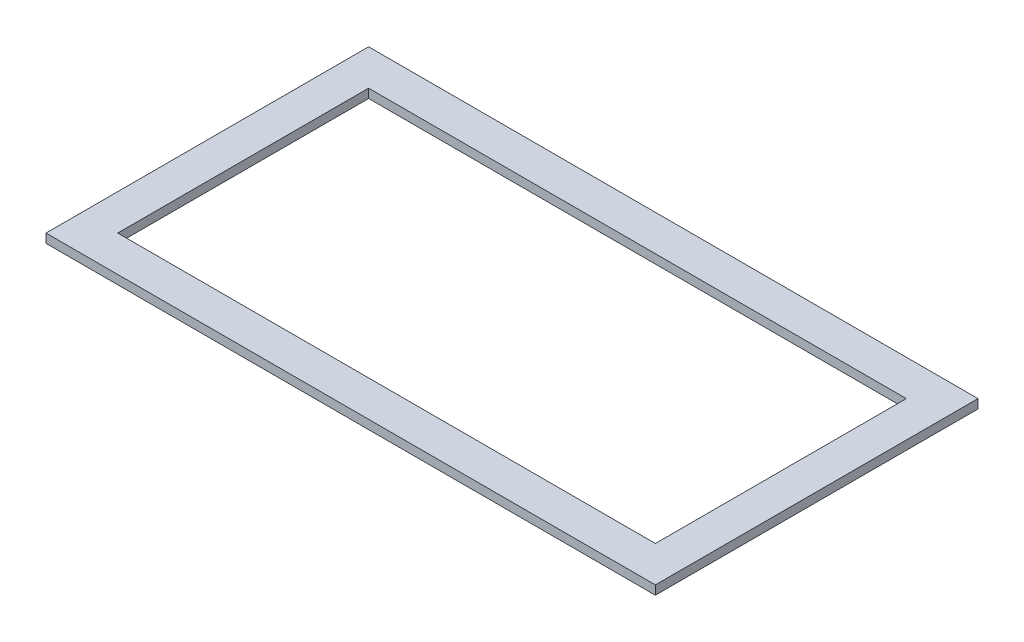
ISO-10303-21;
HEADER;
FILE_DESCRIPTION(('STEP AP214'),'2;1');
FILE_NAME('part.step','',(''),(''),'','','');
FILE_SCHEMA(('AUTOMOTIVE_DESIGN { 1 0 10303 214 1 1 1 1 }'));
ENDSEC;
DATA;
#1=APPLICATION_CONTEXT('core data for automotive mechanical design processes');
#2=APPLICATION_PROTOCOL_DEFINITION('international standard','automotive_design',2000,#1);
#3=PRODUCT_CONTEXT('',#1,'mechanical');
#4=PRODUCT('Part','Part','',(#3));
#5=PRODUCT_RELATED_PRODUCT_CATEGORY('part','',(#4));
#6=PRODUCT_DEFINITION_FORMATION('','',#4);
#7=PRODUCT_DEFINITION_CONTEXT('part definition',#1,'design');
#8=PRODUCT_DEFINITION('design','',#6,#7);
#9=PRODUCT_DEFINITION_SHAPE('','',#8);
#10=(LENGTH_UNIT() NAMED_UNIT(*) SI_UNIT(.MILLI.,.METRE.));
#11=(NAMED_UNIT(*) PLANE_ANGLE_UNIT() SI_UNIT($,.RADIAN.));
#12=(NAMED_UNIT(*) SI_UNIT($,.STERADIAN.) SOLID_ANGLE_UNIT());
#13=UNCERTAINTY_MEASURE_WITH_UNIT(LENGTH_MEASURE(1.E-05),#10,'distance_accuracy_value','');
#14=(GEOMETRIC_REPRESENTATION_CONTEXT(3) GLOBAL_UNCERTAINTY_ASSIGNED_CONTEXT((#13)) GLOBAL_UNIT_ASSIGNED_CONTEXT((#10,
#11,#12)) REPRESENTATION_CONTEXT('',''));
#15=CARTESIAN_POINT('',(0.,0.,0.));
#16=DIRECTION('',(0.,0.,1.));
#17=DIRECTION('',(1.,0.,0.));
#18=AXIS2_PLACEMENT_3D('',#15,#16,#17);
#19=CARTESIAN_POINT('',(107.95,3.175,57.15));
#20=DIRECTION('',(-1.,0.,0.));
#21=DIRECTION('',(0.,0.,1.));
#22=AXIS2_PLACEMENT_3D('',#19,#20,#21);
#23=PLANE('',#22);
#24=DIRECTION('',(0.,0.,-1.));
#25=VECTOR('',#24,1.);
#26=CARTESIAN_POINT('',(107.95,0.,57.15));
#27=LINE('',#26,#25);
#28=CARTESIAN_POINT('',(107.95,0.,57.15));
#29=VERTEX_POINT('',#28);
#30=CARTESIAN_POINT('',(107.95,0.,-57.15));
#31=VERTEX_POINT('',#30);
#32=EDGE_CURVE('E156',#29,#31,#27,.T.);
#33=ORIENTED_EDGE('',*,*,#32,.T.);
#34=DIRECTION('',(0.,-1.,0.));
#35=VECTOR('',#34,1.);
#36=CARTESIAN_POINT('',(107.95,3.175,-57.15));
#37=LINE('',#36,#35);
#38=CARTESIAN_POINT('',(107.95,3.175,-57.15));
#39=VERTEX_POINT('',#38);
#40=EDGE_CURVE('E11',#39,#31,#37,.T.);
#41=ORIENTED_EDGE('',*,*,#40,.F.);
#42=DIRECTION('',(0.,0.,-1.));
#43=VECTOR('',#42,1.);
#44=CARTESIAN_POINT('',(107.95,3.175,57.15));
#45=LINE('',#44,#43);
#46=CARTESIAN_POINT('',(107.95,3.175,57.15));
#47=VERTEX_POINT('',#46);
#48=EDGE_CURVE('E157',#47,#39,#45,.T.);
#49=ORIENTED_EDGE('',*,*,#48,.F.);
#50=DIRECTION('',(0.,-1.,0.));
#51=VECTOR('',#50,1.);
#52=CARTESIAN_POINT('',(107.95,3.175,57.15));
#53=LINE('',#52,#51);
#54=EDGE_CURVE('E171',#47,#29,#53,.T.);
#55=ORIENTED_EDGE('',*,*,#54,.T.);
#56=EDGE_LOOP('',(#33,#41,#49,#55));
#57=FACE_BOUND('',#56,.T.);
#58=ADVANCED_FACE('F45',(#57),#23,.F.);
#59=CARTESIAN_POINT('',(-107.95,3.175,-57.15));
#60=DIRECTION('',(0.,0.,1.));
#61=DIRECTION('',(1.,0.,0.));
#62=AXIS2_PLACEMENT_3D('',#59,#60,#61);
#63=PLANE('',#62);
#64=DIRECTION('',(-1.,0.,0.));
#65=VECTOR('',#64,1.);
#66=CARTESIAN_POINT('',(-107.95,0.,-57.15));
#67=LINE('',#66,#65);
#68=CARTESIAN_POINT('',(-107.95,0.,-57.15));
#69=VERTEX_POINT('',#68);
#70=EDGE_CURVE('E175',#31,#69,#67,.T.);
#71=ORIENTED_EDGE('',*,*,#70,.T.);
#72=DIRECTION('',(0.,-1.,0.));
#73=VECTOR('',#72,1.);
#74=CARTESIAN_POINT('',(-107.95,3.175,-57.15));
#75=LINE('',#74,#73);
#76=CARTESIAN_POINT('',(-107.95,3.175,-57.15));
#77=VERTEX_POINT('',#76);
#78=EDGE_CURVE('E53',#77,#69,#75,.T.);
#79=ORIENTED_EDGE('',*,*,#78,.F.);
#80=DIRECTION('',(-1.,0.,0.));
#81=VECTOR('',#80,1.);
#82=CARTESIAN_POINT('',(-107.95,3.175,-57.15));
#83=LINE('',#82,#81);
#84=EDGE_CURVE('E161',#39,#77,#83,.T.);
#85=ORIENTED_EDGE('',*,*,#84,.F.);
#86=ORIENTED_EDGE('',*,*,#40,.T.);
#87=EDGE_LOOP('',(#71,#79,#85,#86));
#88=FACE_BOUND('',#87,.T.);
#89=ADVANCED_FACE('F209',(#88),#63,.F.);
#90=CARTESIAN_POINT('',(-107.95,3.175,57.15));
#91=DIRECTION('',(1.,0.,0.));
#92=DIRECTION('',(0.,0.,-1.));
#93=AXIS2_PLACEMENT_3D('',#90,#91,#92);
#94=PLANE('',#93);
#95=DIRECTION('',(0.,0.,1.));
#96=VECTOR('',#95,1.);
#97=CARTESIAN_POINT('',(-107.95,0.,57.15));
#98=LINE('',#97,#96);
#99=CARTESIAN_POINT('',(-107.95,0.,57.15));
#100=VERTEX_POINT('',#99);
#101=EDGE_CURVE('E178',#69,#100,#98,.T.);
#102=ORIENTED_EDGE('',*,*,#101,.T.);
#103=DIRECTION('',(0.,-1.,0.));
#104=VECTOR('',#103,1.);
#105=CARTESIAN_POINT('',(-107.95,3.175,57.15));
#106=LINE('',#105,#104);
#107=CARTESIAN_POINT('',(-107.95,3.175,57.15));
#108=VERTEX_POINT('',#107);
#109=EDGE_CURVE('E186',#108,#100,#106,.T.);
#110=ORIENTED_EDGE('',*,*,#109,.F.);
#111=DIRECTION('',(0.,0.,1.));
#112=VECTOR('',#111,1.);
#113=CARTESIAN_POINT('',(-107.95,3.175,57.15));
#114=LINE('',#113,#112);
#115=EDGE_CURVE('E165',#77,#108,#114,.T.);
#116=ORIENTED_EDGE('',*,*,#115,.F.);
#117=ORIENTED_EDGE('',*,*,#78,.T.);
#118=EDGE_LOOP('',(#102,#110,#116,#117));
#119=FACE_BOUND('',#118,.T.);
#120=ADVANCED_FACE('F195',(#119),#94,.F.);
#121=CARTESIAN_POINT('',(-107.95,3.175,57.15));
#122=DIRECTION('',(0.,0.,-1.));
#123=DIRECTION('',(-1.,0.,0.));
#124=AXIS2_PLACEMENT_3D('',#121,#122,#123);
#125=PLANE('',#124);
#126=DIRECTION('',(1.,0.,0.));
#127=VECTOR('',#126,1.);
#128=CARTESIAN_POINT('',(-107.95,0.,57.15));
#129=LINE('',#128,#127);
#130=EDGE_CURVE('E162',#100,#29,#129,.T.);
#131=ORIENTED_EDGE('',*,*,#130,.T.);
#132=ORIENTED_EDGE('',*,*,#54,.F.);
#133=DIRECTION('',(1.,0.,0.));
#134=VECTOR('',#133,1.);
#135=CARTESIAN_POINT('',(-107.95,3.175,57.15));
#136=LINE('',#135,#134);
#137=EDGE_CURVE('E168',#108,#47,#136,.T.);
#138=ORIENTED_EDGE('',*,*,#137,.F.);
#139=ORIENTED_EDGE('',*,*,#109,.T.);
#140=EDGE_LOOP('',(#131,#132,#138,#139));
#141=FACE_BOUND('',#140,.T.);
#142=ADVANCED_FACE('F202',(#141),#125,.F.);
#143=CARTESIAN_POINT('',(0.,3.175,0.));
#144=DIRECTION('',(0.,-1.,0.));
#145=DIRECTION('',(0.,0.,-1.));
#146=AXIS2_PLACEMENT_3D('',#143,#144,#145);
#147=PLANE('',#146);
#148=DIRECTION('',(0.,0.,1.));
#149=VECTOR('',#148,1.);
#150=CARTESIAN_POINT('',(-95.25,3.175,44.45));
#151=LINE('',#150,#149);
#152=CARTESIAN_POINT('',(-95.25,3.175,-44.45));
#153=VERTEX_POINT('',#152);
#154=CARTESIAN_POINT('',(-95.25,3.175,44.45));
#155=VERTEX_POINT('',#154);
#156=EDGE_CURVE('E138',#153,#155,#151,.T.);
#157=ORIENTED_EDGE('',*,*,#156,.F.);
#158=DIRECTION('',(-1.,0.,0.));
#159=VECTOR('',#158,1.);
#160=CARTESIAN_POINT('',(-95.25,3.175,-44.45));
#161=LINE('',#160,#159);
#162=CARTESIAN_POINT('',(95.25,3.175,-44.45));
#163=VERTEX_POINT('',#162);
#164=EDGE_CURVE('E128',#163,#153,#161,.T.);
#165=ORIENTED_EDGE('',*,*,#164,.F.);
#166=DIRECTION('',(0.,0.,-1.));
#167=VECTOR('',#166,1.);
#168=CARTESIAN_POINT('',(95.25,3.175,44.45));
#169=LINE('',#168,#167);
#170=CARTESIAN_POINT('',(95.25,3.175,44.45));
#171=VERTEX_POINT('',#170);
#172=EDGE_CURVE('E142',#171,#163,#169,.T.);
#173=ORIENTED_EDGE('',*,*,#172,.F.);
#174=DIRECTION('',(1.,0.,0.));
#175=VECTOR('',#174,1.);
#176=CARTESIAN_POINT('',(-95.25,3.175,44.45));
#177=LINE('',#176,#175);
#178=EDGE_CURVE('E60',#155,#171,#177,.T.);
#179=ORIENTED_EDGE('',*,*,#178,.F.);
#180=EDGE_LOOP('',(#157,#165,#173,#179));
#181=FACE_BOUND('',#180,.T.);
#182=ORIENTED_EDGE('',*,*,#48,.T.);
#183=ORIENTED_EDGE('',*,*,#84,.T.);
#184=ORIENTED_EDGE('',*,*,#115,.T.);
#185=ORIENTED_EDGE('',*,*,#137,.T.);
#186=EDGE_LOOP('',(#182,#183,#184,#185));
#187=FACE_BOUND('',#186,.T.);
#188=ADVANCED_FACE('F208',(#181,#187),#147,.F.);
#189=CARTESIAN_POINT('',(0.,0.,0.));
#190=DIRECTION('',(0.,-1.,0.));
#191=DIRECTION('',(0.,0.,-1.));
#192=AXIS2_PLACEMENT_3D('',#189,#190,#191);
#193=PLANE('',#192);
#194=DIRECTION('',(-1.,0.,0.));
#195=VECTOR('',#194,1.);
#196=CARTESIAN_POINT('',(-95.25,0.,-44.45));
#197=LINE('',#196,#195);
#198=CARTESIAN_POINT('',(95.25,0.,-44.45));
#199=VERTEX_POINT('',#198);
#200=CARTESIAN_POINT('',(-95.25,0.,-44.45));
#201=VERTEX_POINT('',#200);
#202=EDGE_CURVE('E125',#199,#201,#197,.T.);
#203=ORIENTED_EDGE('',*,*,#202,.T.);
#204=DIRECTION('',(0.,0.,1.));
#205=VECTOR('',#204,1.);
#206=CARTESIAN_POINT('',(-95.25,0.,44.45));
#207=LINE('',#206,#205);
#208=CARTESIAN_POINT('',(-95.25,0.,44.45));
#209=VERTEX_POINT('',#208);
#210=EDGE_CURVE('E111',#201,#209,#207,.T.);
#211=ORIENTED_EDGE('',*,*,#210,.T.);
#212=DIRECTION('',(1.,0.,0.));
#213=VECTOR('',#212,1.);
#214=CARTESIAN_POINT('',(-95.25,0.,44.45));
#215=LINE('',#214,#213);
#216=CARTESIAN_POINT('',(95.25,0.,44.45));
#217=VERTEX_POINT('',#216);
#218=EDGE_CURVE('E147',#209,#217,#215,.T.);
#219=ORIENTED_EDGE('',*,*,#218,.T.);
#220=DIRECTION('',(0.,0.,-1.));
#221=VECTOR('',#220,1.);
#222=CARTESIAN_POINT('',(95.25,0.,44.45));
#223=LINE('',#222,#221);
#224=EDGE_CURVE('E134',#217,#199,#223,.T.);
#225=ORIENTED_EDGE('',*,*,#224,.T.);
#226=EDGE_LOOP('',(#203,#211,#219,#225));
#227=FACE_BOUND('',#226,.T.);
#228=ORIENTED_EDGE('',*,*,#32,.F.);
#229=ORIENTED_EDGE('',*,*,#130,.F.);
#230=ORIENTED_EDGE('',*,*,#101,.F.);
#231=ORIENTED_EDGE('',*,*,#70,.F.);
#232=EDGE_LOOP('',(#228,#229,#230,#231));
#233=FACE_BOUND('',#232,.T.);
#234=ADVANCED_FACE('F132',(#227,#233),#193,.T.);
#235=CARTESIAN_POINT('',(-95.25,-210.222406037035,-44.45));
#236=DIRECTION('',(0.,0.,-1.));
#237=DIRECTION('',(-1.,0.,0.));
#238=AXIS2_PLACEMENT_3D('',#235,#236,#237);
#239=PLANE('',#238);
#240=DIRECTION('',(0.,1.,0.));
#241=VECTOR('',#240,1.);
#242=CARTESIAN_POINT('',(95.25,-210.222406037035,-44.45));
#243=LINE('',#242,#241);
#244=EDGE_CURVE('E68',#199,#163,#243,.T.);
#245=ORIENTED_EDGE('',*,*,#244,.T.);
#246=ORIENTED_EDGE('',*,*,#164,.T.);
#247=DIRECTION('',(0.,1.,0.));
#248=VECTOR('',#247,1.);
#249=CARTESIAN_POINT('',(-95.25,-210.222406037035,-44.45));
#250=LINE('',#249,#248);
#251=EDGE_CURVE('E115',#201,#153,#250,.T.);
#252=ORIENTED_EDGE('',*,*,#251,.F.);
#253=ORIENTED_EDGE('',*,*,#202,.F.);
#254=EDGE_LOOP('',(#245,#246,#252,#253));
#255=FACE_BOUND('',#254,.T.);
#256=ADVANCED_FACE('F124',(#255),#239,.F.);
#257=CARTESIAN_POINT('',(-95.25,-210.222406037035,44.45));
#258=DIRECTION('',(-1.,0.,0.));
#259=DIRECTION('',(0.,0.,1.));
#260=AXIS2_PLACEMENT_3D('',#257,#258,#259);
#261=PLANE('',#260);
#262=ORIENTED_EDGE('',*,*,#251,.T.);
#263=ORIENTED_EDGE('',*,*,#156,.T.);
#264=DIRECTION('',(0.,1.,0.));
#265=VECTOR('',#264,1.);
#266=CARTESIAN_POINT('',(-95.25,-210.222406037035,44.45));
#267=LINE('',#266,#265);
#268=EDGE_CURVE('E117',#209,#155,#267,.T.);
#269=ORIENTED_EDGE('',*,*,#268,.F.);
#270=ORIENTED_EDGE('',*,*,#210,.F.);
#271=EDGE_LOOP('',(#262,#263,#269,#270));
#272=FACE_BOUND('',#271,.T.);
#273=ADVANCED_FACE('F113',(#272),#261,.F.);
#274=CARTESIAN_POINT('',(-95.25,-210.222406037035,44.45));
#275=DIRECTION('',(0.,0.,1.));
#276=DIRECTION('',(1.,0.,0.));
#277=AXIS2_PLACEMENT_3D('',#274,#275,#276);
#278=PLANE('',#277);
#279=ORIENTED_EDGE('',*,*,#268,.T.);
#280=ORIENTED_EDGE('',*,*,#178,.T.);
#281=DIRECTION('',(0.,1.,0.));
#282=VECTOR('',#281,1.);
#283=CARTESIAN_POINT('',(95.25,-210.222406037035,44.45));
#284=LINE('',#283,#282);
#285=EDGE_CURVE('E146',#217,#171,#284,.T.);
#286=ORIENTED_EDGE('',*,*,#285,.F.);
#287=ORIENTED_EDGE('',*,*,#218,.F.);
#288=EDGE_LOOP('',(#279,#280,#286,#287));
#289=FACE_BOUND('',#288,.T.);
#290=ADVANCED_FACE('F228',(#289),#278,.F.);
#291=CARTESIAN_POINT('',(95.25,-210.222406037035,44.45));
#292=DIRECTION('',(1.,0.,0.));
#293=DIRECTION('',(0.,0.,-1.));
#294=AXIS2_PLACEMENT_3D('',#291,#292,#293);
#295=PLANE('',#294);
#296=ORIENTED_EDGE('',*,*,#285,.T.);
#297=ORIENTED_EDGE('',*,*,#172,.T.);
#298=ORIENTED_EDGE('',*,*,#244,.F.);
#299=ORIENTED_EDGE('',*,*,#224,.F.);
#300=EDGE_LOOP('',(#296,#297,#298,#299));
#301=FACE_BOUND('',#300,.T.);
#302=ADVANCED_FACE('F231',(#301),#295,.F.);
#303=CLOSED_SHELL('',(#58,#89,#120,#142,#188,#234,#256,#273,#290,#302));
#304=MANIFOLD_SOLID_BREP('B2',#303);
#305=ADVANCED_BREP_SHAPE_REPRESENTATION('',(#18,#304),#14);
#306=SHAPE_DEFINITION_REPRESENTATION(#9,#305);
ENDSEC;
END-ISO-10303-21;
